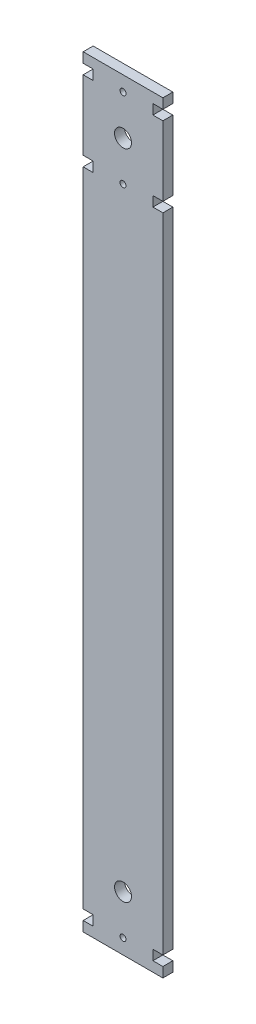
ISO-10303-21;
HEADER;
FILE_DESCRIPTION(('STEP AP214'),'2;1');
FILE_NAME('part.step','',(''),(''),'','','');
FILE_SCHEMA(('AUTOMOTIVE_DESIGN { 1 0 10303 214 1 1 1 1 }'));
ENDSEC;
DATA;
#1=APPLICATION_CONTEXT('core data for automotive mechanical design processes');
#2=APPLICATION_PROTOCOL_DEFINITION('international standard','automotive_design',2000,#1);
#3=PRODUCT_CONTEXT('',#1,'mechanical');
#4=PRODUCT('Part','Part','',(#3));
#5=PRODUCT_RELATED_PRODUCT_CATEGORY('part','',(#4));
#6=PRODUCT_DEFINITION_FORMATION('','',#4);
#7=PRODUCT_DEFINITION_CONTEXT('part definition',#1,'design');
#8=PRODUCT_DEFINITION('design','',#6,#7);
#9=PRODUCT_DEFINITION_SHAPE('','',#8);
#10=(LENGTH_UNIT() NAMED_UNIT(*) SI_UNIT(.MILLI.,.METRE.));
#11=(NAMED_UNIT(*) PLANE_ANGLE_UNIT() SI_UNIT($,.RADIAN.));
#12=(NAMED_UNIT(*) SI_UNIT($,.STERADIAN.) SOLID_ANGLE_UNIT());
#13=UNCERTAINTY_MEASURE_WITH_UNIT(LENGTH_MEASURE(1.E-05),#10,'distance_accuracy_value','');
#14=(GEOMETRIC_REPRESENTATION_CONTEXT(3) GLOBAL_UNCERTAINTY_ASSIGNED_CONTEXT((#13)) GLOBAL_UNIT_ASSIGNED_CONTEXT((#10,
#11,#12)) REPRESENTATION_CONTEXT('',''));
#15=CARTESIAN_POINT('',(0.,0.,0.));
#16=DIRECTION('',(0.,0.,1.));
#17=DIRECTION('',(1.,0.,0.));
#18=AXIS2_PLACEMENT_3D('',#15,#16,#17);
#19=CARTESIAN_POINT('',(-46.5428244656313,-25.2154467168999,5.00000000000018));
#20=DIRECTION('',(0.,0.,1.));
#21=DIRECTION('',(1.,0.,0.));
#22=AXIS2_PLACEMENT_3D('',#19,#20,#21);
#23=PLANE('',#22);
#24=CARTESIAN_POINT('',(-46.5428244656313,-17.7154467168999,5.00000000000018));
#25=DIRECTION('',(0.,0.,1.));
#26=DIRECTION('',(1.,0.,0.));
#27=AXIS2_PLACEMENT_3D('',#24,#25,#26);
#28=CIRCLE('',#27,1.5);
#29=CARTESIAN_POINT('',(-45.0428244656313,-17.7154467168999,5.00000000000018));
#30=VERTEX_POINT('',#29);
#31=EDGE_CURVE('E369',#30,#30,#28,.T.);
#32=ORIENTED_EDGE('',*,*,#31,.F.);
#33=EDGE_LOOP('',(#32));
#34=FACE_BOUND('',#33,.T.);
#35=DIRECTION('',(0.,-1.,0.));
#36=VECTOR('',#35,1.);
#37=CARTESIAN_POINT('',(-66.5428244656313,-20.2154467168998,5.00000000000018));
#38=LINE('',#37,#36);
#39=CARTESIAN_POINT('',(-66.5428244656313,-20.2154467168998,5.00000000000018));
#40=VERTEX_POINT('',#39);
#41=CARTESIAN_POINT('',(-66.5428244656313,-342.7154467169,5.00000000000018));
#42=VERTEX_POINT('',#41);
#43=EDGE_CURVE('E232',#40,#42,#38,.T.);
#44=ORIENTED_EDGE('',*,*,#43,.T.);
#45=DIRECTION('',(1.,0.,0.));
#46=VECTOR('',#45,1.);
#47=CARTESIAN_POINT('',(-66.5428244656313,-342.7154467169,5.00000000000018));
#48=LINE('',#47,#46);
#49=CARTESIAN_POINT('',(-61.5428244656313,-342.7154467169,5.00000000000018));
#50=VERTEX_POINT('',#49);
#51=EDGE_CURVE('E350',#42,#50,#48,.T.);
#52=ORIENTED_EDGE('',*,*,#51,.T.);
#53=DIRECTION('',(0.,-1.,0.));
#54=VECTOR('',#53,1.);
#55=CARTESIAN_POINT('',(-61.5428244656313,-342.7154467169,5.00000000000018));
#56=LINE('',#55,#54);
#57=CARTESIAN_POINT('',(-61.5428244656313,-347.7154467169,5.00000000000018));
#58=VERTEX_POINT('',#57);
#59=EDGE_CURVE('E459',#50,#58,#56,.T.);
#60=ORIENTED_EDGE('',*,*,#59,.T.);
#61=DIRECTION('',(-1.,0.,0.));
#62=VECTOR('',#61,1.);
#63=CARTESIAN_POINT('',(-61.5428244656313,-347.7154467169,5.00000000000018));
#64=LINE('',#63,#62);
#65=CARTESIAN_POINT('',(-66.5428244656313,-347.7154467169,5.00000000000018));
#66=VERTEX_POINT('',#65);
#67=EDGE_CURVE('E466',#58,#66,#64,.T.);
#68=ORIENTED_EDGE('',*,*,#67,.T.);
#69=DIRECTION('',(0.,-1.,0.));
#70=VECTOR('',#69,1.);
#71=CARTESIAN_POINT('',(-66.5428244656313,-347.7154467169,5.00000000000018));
#72=LINE('',#71,#70);
#73=CARTESIAN_POINT('',(-66.5428244656313,-352.7154467169,5.00000000000018));
#74=VERTEX_POINT('',#73);
#75=EDGE_CURVE('E471',#66,#74,#72,.T.);
#76=ORIENTED_EDGE('',*,*,#75,.T.);
#77=DIRECTION('',(1.,0.,0.));
#78=VECTOR('',#77,1.);
#79=CARTESIAN_POINT('',(-66.5428244656313,-352.7154467169,5.00000000000018));
#80=LINE('',#79,#78);
#81=CARTESIAN_POINT('',(-26.5428244656313,-352.7154467169,5.00000000000018));
#82=VERTEX_POINT('',#81);
#83=EDGE_CURVE('E478',#74,#82,#80,.T.);
#84=ORIENTED_EDGE('',*,*,#83,.T.);
#85=DIRECTION('',(0.,1.,0.));
#86=VECTOR('',#85,1.);
#87=CARTESIAN_POINT('',(-26.5428244656313,-352.7154467169,5.00000000000018));
#88=LINE('',#87,#86);
#89=CARTESIAN_POINT('',(-26.5428244656313,-347.7154467169,5.00000000000018));
#90=VERTEX_POINT('',#89);
#91=EDGE_CURVE('E438',#82,#90,#88,.T.);
#92=ORIENTED_EDGE('',*,*,#91,.T.);
#93=DIRECTION('',(-1.,0.,0.));
#94=VECTOR('',#93,1.);
#95=CARTESIAN_POINT('',(-26.5428244656313,-347.7154467169,5.00000000000018));
#96=LINE('',#95,#94);
#97=CARTESIAN_POINT('',(-31.5428244656313,-347.7154467169,5.00000000000018));
#98=VERTEX_POINT('',#97);
#99=EDGE_CURVE('E436',#90,#98,#96,.T.);
#100=ORIENTED_EDGE('',*,*,#99,.T.);
#101=DIRECTION('',(0.,1.,0.));
#102=VECTOR('',#101,1.);
#103=CARTESIAN_POINT('',(-31.5428244656313,-347.7154467169,5.00000000000018));
#104=LINE('',#103,#102);
#105=CARTESIAN_POINT('',(-31.5428244656313,-342.7154467169,5.00000000000018));
#106=VERTEX_POINT('',#105);
#107=EDGE_CURVE('E426',#98,#106,#104,.T.);
#108=ORIENTED_EDGE('',*,*,#107,.T.);
#109=DIRECTION('',(1.,0.,0.));
#110=VECTOR('',#109,1.);
#111=CARTESIAN_POINT('',(-31.5428244656313,-342.7154467169,5.00000000000018));
#112=LINE('',#111,#110);
#113=CARTESIAN_POINT('',(-26.5428244656313,-342.7154467169,5.00000000000018));
#114=VERTEX_POINT('',#113);
#115=EDGE_CURVE('E431',#106,#114,#112,.T.);
#116=ORIENTED_EDGE('',*,*,#115,.T.);
#117=DIRECTION('',(0.,1.,0.));
#118=VECTOR('',#117,1.);
#119=CARTESIAN_POINT('',(-26.5428244656313,-25.2154467168999,5.00000000000018));
#120=LINE('',#119,#118);
#121=CARTESIAN_POINT('',(-26.5428244656313,-20.2154467168998,5.00000000000018));
#122=VERTEX_POINT('',#121);
#123=EDGE_CURVE('E124',#114,#122,#120,.T.);
#124=ORIENTED_EDGE('',*,*,#123,.T.);
#125=DIRECTION('',(-1.,0.,0.));
#126=VECTOR('',#125,1.);
#127=CARTESIAN_POINT('',(-26.5428244656313,-20.2154467168998,5.00000000000018));
#128=LINE('',#127,#126);
#129=CARTESIAN_POINT('',(-31.5428244656313,-20.2154467168999,5.00000000000018));
#130=VERTEX_POINT('',#129);
#131=EDGE_CURVE('E381',#122,#130,#128,.T.);
#132=ORIENTED_EDGE('',*,*,#131,.T.);
#133=DIRECTION('',(0.,1.,0.));
#134=VECTOR('',#133,1.);
#135=CARTESIAN_POINT('',(-31.5428244656313,-20.2154467168999,5.00000000000018));
#136=LINE('',#135,#134);
#137=CARTESIAN_POINT('',(-31.5428244656313,-15.2154467168999,5.00000000000018));
#138=VERTEX_POINT('',#137);
#139=EDGE_CURVE('E278',#130,#138,#136,.T.);
#140=ORIENTED_EDGE('',*,*,#139,.T.);
#141=DIRECTION('',(1.,0.,0.));
#142=VECTOR('',#141,1.);
#143=CARTESIAN_POINT('',(-31.5428244656313,-15.2154467168999,5.00000000000018));
#144=LINE('',#143,#142);
#145=CARTESIAN_POINT('',(-26.5428244656313,-15.2154467168998,5.00000000000018));
#146=VERTEX_POINT('',#145);
#147=EDGE_CURVE('E301',#138,#146,#144,.T.);
#148=ORIENTED_EDGE('',*,*,#147,.T.);
#149=DIRECTION('',(0.,1.,0.));
#150=VECTOR('',#149,1.);
#151=CARTESIAN_POINT('',(-26.5428244656313,-15.2154467168998,5.00000000000018));
#152=LINE('',#151,#150);
#153=CARTESIAN_POINT('',(-26.5428244656313,19.7845532831001,5.00000000000018));
#154=VERTEX_POINT('',#153);
#155=EDGE_CURVE('E298',#146,#154,#152,.T.);
#156=ORIENTED_EDGE('',*,*,#155,.T.);
#157=DIRECTION('',(-1.,0.,0.));
#158=VECTOR('',#157,1.);
#159=CARTESIAN_POINT('',(-26.5428244656313,19.7845532831001,5.00000000000018));
#160=LINE('',#159,#158);
#161=CARTESIAN_POINT('',(-31.5428244656313,19.7845532831001,5.00000000000018));
#162=VERTEX_POINT('',#161);
#163=EDGE_CURVE('E300',#154,#162,#160,.T.);
#164=ORIENTED_EDGE('',*,*,#163,.T.);
#165=DIRECTION('',(0.,1.,0.));
#166=VECTOR('',#165,1.);
#167=CARTESIAN_POINT('',(-31.5428244656313,19.7845532831001,5.00000000000018));
#168=LINE('',#167,#166);
#169=CARTESIAN_POINT('',(-31.5428244656313,24.7845532831001,5.00000000000018));
#170=VERTEX_POINT('',#169);
#171=EDGE_CURVE('E303',#162,#170,#168,.T.);
#172=ORIENTED_EDGE('',*,*,#171,.T.);
#173=DIRECTION('',(1.,0.,0.));
#174=VECTOR('',#173,1.);
#175=CARTESIAN_POINT('',(-31.5428244656313,24.7845532831001,5.00000000000018));
#176=LINE('',#175,#174);
#177=CARTESIAN_POINT('',(-26.5428244656313,24.7845532831001,5.00000000000018));
#178=VERTEX_POINT('',#177);
#179=EDGE_CURVE('E309',#170,#178,#176,.T.);
#180=ORIENTED_EDGE('',*,*,#179,.T.);
#181=DIRECTION('',(0.,1.,0.));
#182=VECTOR('',#181,1.);
#183=CARTESIAN_POINT('',(-26.5428244656313,24.7845532831001,5.00000000000018));
#184=LINE('',#183,#182);
#185=CARTESIAN_POINT('',(-26.5428244656313,29.7845532831002,5.00000000000018));
#186=VERTEX_POINT('',#185);
#187=EDGE_CURVE('E311',#178,#186,#184,.T.);
#188=ORIENTED_EDGE('',*,*,#187,.T.);
#189=DIRECTION('',(-1.,0.,0.));
#190=VECTOR('',#189,1.);
#191=CARTESIAN_POINT('',(-26.5428244656313,29.7845532831002,5.00000000000018));
#192=LINE('',#191,#190);
#193=CARTESIAN_POINT('',(-66.5428244656313,29.7845532831002,5.00000000000018));
#194=VERTEX_POINT('',#193);
#195=EDGE_CURVE('E313',#186,#194,#192,.T.);
#196=ORIENTED_EDGE('',*,*,#195,.T.);
#197=DIRECTION('',(0.,-1.,0.));
#198=VECTOR('',#197,1.);
#199=CARTESIAN_POINT('',(-66.5428244656313,29.7845532831002,5.00000000000018));
#200=LINE('',#199,#198);
#201=CARTESIAN_POINT('',(-66.5428244656313,24.7845532831001,5.00000000000018));
#202=VERTEX_POINT('',#201);
#203=EDGE_CURVE('E315',#194,#202,#200,.T.);
#204=ORIENTED_EDGE('',*,*,#203,.T.);
#205=DIRECTION('',(1.,0.,0.));
#206=VECTOR('',#205,1.);
#207=CARTESIAN_POINT('',(-66.5428244656313,24.7845532831001,5.00000000000018));
#208=LINE('',#207,#206);
#209=CARTESIAN_POINT('',(-61.5428244656313,24.7845532831001,5.00000000000018));
#210=VERTEX_POINT('',#209);
#211=EDGE_CURVE('E317',#202,#210,#208,.T.);
#212=ORIENTED_EDGE('',*,*,#211,.T.);
#213=DIRECTION('',(0.,-1.,0.));
#214=VECTOR('',#213,1.);
#215=CARTESIAN_POINT('',(-61.5428244656313,24.7845532831001,5.00000000000018));
#216=LINE('',#215,#214);
#217=CARTESIAN_POINT('',(-61.5428244656313,19.7845532831001,5.00000000000018));
#218=VERTEX_POINT('',#217);
#219=EDGE_CURVE('E319',#210,#218,#216,.T.);
#220=ORIENTED_EDGE('',*,*,#219,.T.);
#221=DIRECTION('',(-1.,0.,0.));
#222=VECTOR('',#221,1.);
#223=CARTESIAN_POINT('',(-61.5428244656313,19.7845532831001,5.00000000000018));
#224=LINE('',#223,#222);
#225=CARTESIAN_POINT('',(-66.5428244656313,19.7845532831001,5.00000000000018));
#226=VERTEX_POINT('',#225);
#227=EDGE_CURVE('E321',#218,#226,#224,.T.);
#228=ORIENTED_EDGE('',*,*,#227,.T.);
#229=DIRECTION('',(0.,-1.,0.));
#230=VECTOR('',#229,1.);
#231=CARTESIAN_POINT('',(-66.5428244656313,19.7845532831001,5.00000000000018));
#232=LINE('',#231,#230);
#233=CARTESIAN_POINT('',(-66.5428244656313,-15.2154467168998,5.00000000000018));
#234=VERTEX_POINT('',#233);
#235=EDGE_CURVE('E177',#226,#234,#232,.T.);
#236=ORIENTED_EDGE('',*,*,#235,.T.);
#237=DIRECTION('',(1.,0.,0.));
#238=VECTOR('',#237,1.);
#239=CARTESIAN_POINT('',(-66.5428244656313,-15.2154467168998,5.00000000000018));
#240=LINE('',#239,#238);
#241=CARTESIAN_POINT('',(-61.5428244656313,-15.2154467168999,5.00000000000018));
#242=VERTEX_POINT('',#241);
#243=EDGE_CURVE('E171',#234,#242,#240,.T.);
#244=ORIENTED_EDGE('',*,*,#243,.T.);
#245=DIRECTION('',(0.,-1.,0.));
#246=VECTOR('',#245,1.);
#247=CARTESIAN_POINT('',(-61.5428244656313,-15.2154467168999,5.00000000000018));
#248=LINE('',#247,#246);
#249=CARTESIAN_POINT('',(-61.5428244656313,-20.2154467168999,5.00000000000018));
#250=VERTEX_POINT('',#249);
#251=EDGE_CURVE('E175',#242,#250,#248,.T.);
#252=ORIENTED_EDGE('',*,*,#251,.T.);
#253=DIRECTION('',(-1.,0.,0.));
#254=VECTOR('',#253,1.);
#255=CARTESIAN_POINT('',(-61.5428244656313,-20.2154467168999,5.00000000000018));
#256=LINE('',#255,#254);
#257=EDGE_CURVE('E50',#250,#40,#256,.T.);
#258=ORIENTED_EDGE('',*,*,#257,.T.);
#259=EDGE_LOOP('',(#44,#52,#60,#68,#76,#84,#92,#100,#108,#116,#124,#132,#140,#148,#156,#164,
#172,#180,#188,#196,#204,#212,#220,#228,#236,#244,#252,#258));
#260=FACE_BOUND('',#259,.T.);
#261=CARTESIAN_POINT('',(-46.5428244656313,22.2845532831002,5.00000000000018));
#262=DIRECTION('',(0.,0.,1.));
#263=DIRECTION('',(1.,0.,0.));
#264=AXIS2_PLACEMENT_3D('',#261,#262,#263);
#265=CIRCLE('',#264,1.5);
#266=CARTESIAN_POINT('',(-45.0428244656313,22.2845532831002,5.00000000000018));
#267=VERTEX_POINT('',#266);
#268=EDGE_CURVE('E199',#267,#267,#265,.T.);
#269=ORIENTED_EDGE('',*,*,#268,.F.);
#270=EDGE_LOOP('',(#269));
#271=FACE_BOUND('',#270,.T.);
#272=CARTESIAN_POINT('',(-46.5428244656313,2.28455328310016,5.00000000000018));
#273=DIRECTION('',(0.,0.,1.));
#274=DIRECTION('',(1.,0.,0.));
#275=AXIS2_PLACEMENT_3D('',#272,#273,#274);
#276=CIRCLE('',#275,4.25);
#277=CARTESIAN_POINT('',(-42.2928244656313,2.28455328310016,5.00000000000018));
#278=VERTEX_POINT('',#277);
#279=EDGE_CURVE('E361',#278,#278,#276,.T.);
#280=ORIENTED_EDGE('',*,*,#279,.F.);
#281=EDGE_LOOP('',(#280));
#282=FACE_BOUND('',#281,.T.);
#283=CARTESIAN_POINT('',(-46.5428244656313,-325.2154467169,5.00000000000018));
#284=DIRECTION('',(0.,0.,1.));
#285=DIRECTION('',(-1.,0.,0.));
#286=AXIS2_PLACEMENT_3D('',#283,#284,#285);
#287=CIRCLE('',#286,4.24999999999999);
#288=CARTESIAN_POINT('',(-50.7928244656313,-325.2154467169,5.00000000000018));
#289=VERTEX_POINT('',#288);
#290=EDGE_CURVE('E516',#289,#289,#287,.T.);
#291=ORIENTED_EDGE('',*,*,#290,.F.);
#292=EDGE_LOOP('',(#291));
#293=FACE_BOUND('',#292,.T.);
#294=CARTESIAN_POINT('',(-46.5428244656313,-345.2154467169,5.00000000000018));
#295=DIRECTION('',(0.,0.,1.));
#296=DIRECTION('',(1.,0.,0.));
#297=AXIS2_PLACEMENT_3D('',#294,#295,#296);
#298=CIRCLE('',#297,1.5);
#299=CARTESIAN_POINT('',(-45.0428244656313,-345.2154467169,5.00000000000018));
#300=VERTEX_POINT('',#299);
#301=EDGE_CURVE('E510',#300,#300,#298,.T.);
#302=ORIENTED_EDGE('',*,*,#301,.F.);
#303=EDGE_LOOP('',(#302));
#304=FACE_BOUND('',#303,.T.);
#305=ADVANCED_FACE('F33',(#34,#260,#271,#282,#293,#304),#23,.T.);
#306=CARTESIAN_POINT('',(-46.5428244656313,-25.2154467168999,1.76078523325299E-13));
#307=DIRECTION('',(0.,0.,1.));
#308=DIRECTION('',(1.,0.,0.));
#309=AXIS2_PLACEMENT_3D('',#306,#307,#308);
#310=PLANE('',#309);
#311=DIRECTION('',(0.,-1.,0.));
#312=VECTOR('',#311,1.);
#313=CARTESIAN_POINT('',(-66.5428244656313,-20.2154467168998,1.76078523325299E-13));
#314=LINE('',#313,#312);
#315=CARTESIAN_POINT('',(-66.5428244656313,-20.2154467168998,1.76078523325299E-13));
#316=VERTEX_POINT('',#315);
#317=CARTESIAN_POINT('',(-66.5428244656313,-342.7154467169,1.76074432811646E-13));
#318=VERTEX_POINT('',#317);
#319=EDGE_CURVE('E195',#316,#318,#314,.T.);
#320=ORIENTED_EDGE('',*,*,#319,.F.);
#321=DIRECTION('',(-1.,0.,0.));
#322=VECTOR('',#321,1.);
#323=CARTESIAN_POINT('',(-61.5428244656313,-20.2154467168999,1.76078523325299E-13));
#324=LINE('',#323,#322);
#325=CARTESIAN_POINT('',(-61.5428244656313,-20.2154467168999,1.76078523325299E-13));
#326=VERTEX_POINT('',#325);
#327=EDGE_CURVE('E116',#326,#316,#324,.T.);
#328=ORIENTED_EDGE('',*,*,#327,.F.);
#329=DIRECTION('',(0.,-1.,0.));
#330=VECTOR('',#329,1.);
#331=CARTESIAN_POINT('',(-61.5428244656313,-15.2154467168999,1.76078523325299E-13));
#332=LINE('',#331,#330);
#333=CARTESIAN_POINT('',(-61.5428244656313,-15.2154467168999,1.76078523325299E-13));
#334=VERTEX_POINT('',#333);
#335=EDGE_CURVE('E110',#334,#326,#332,.T.);
#336=ORIENTED_EDGE('',*,*,#335,.F.);
#337=DIRECTION('',(1.,0.,0.));
#338=VECTOR('',#337,1.);
#339=CARTESIAN_POINT('',(-66.5428244656313,-15.2154467168998,1.76078523325299E-13));
#340=LINE('',#339,#338);
#341=CARTESIAN_POINT('',(-66.5428244656313,-15.2154467168998,1.76078523325299E-13));
#342=VERTEX_POINT('',#341);
#343=EDGE_CURVE('E185',#342,#334,#340,.T.);
#344=ORIENTED_EDGE('',*,*,#343,.F.);
#345=DIRECTION('',(0.,-1.,0.));
#346=VECTOR('',#345,1.);
#347=CARTESIAN_POINT('',(-66.5428244656313,19.7845532831001,1.76078523325299E-13));
#348=LINE('',#347,#346);
#349=CARTESIAN_POINT('',(-66.5428244656313,19.7845532831001,1.76078523325299E-13));
#350=VERTEX_POINT('',#349);
#351=EDGE_CURVE('E227',#350,#342,#348,.T.);
#352=ORIENTED_EDGE('',*,*,#351,.F.);
#353=DIRECTION('',(-1.,0.,0.));
#354=VECTOR('',#353,1.);
#355=CARTESIAN_POINT('',(-61.5428244656313,19.7845532831001,1.76078523325299E-13));
#356=LINE('',#355,#354);
#357=CARTESIAN_POINT('',(-61.5428244656313,19.7845532831001,1.76078523325299E-13));
#358=VERTEX_POINT('',#357);
#359=EDGE_CURVE('E225',#358,#350,#356,.T.);
#360=ORIENTED_EDGE('',*,*,#359,.F.);
#361=DIRECTION('',(0.,-1.,0.));
#362=VECTOR('',#361,1.);
#363=CARTESIAN_POINT('',(-61.5428244656313,24.7845532831001,1.76078523325299E-13));
#364=LINE('',#363,#362);
#365=CARTESIAN_POINT('',(-61.5428244656313,24.7845532831001,1.76078523325299E-13));
#366=VERTEX_POINT('',#365);
#367=EDGE_CURVE('E223',#366,#358,#364,.T.);
#368=ORIENTED_EDGE('',*,*,#367,.F.);
#369=DIRECTION('',(1.,0.,0.));
#370=VECTOR('',#369,1.);
#371=CARTESIAN_POINT('',(-66.5428244656313,24.7845532831001,1.76078523325299E-13));
#372=LINE('',#371,#370);
#373=CARTESIAN_POINT('',(-66.5428244656313,24.7845532831001,1.76078523325299E-13));
#374=VERTEX_POINT('',#373);
#375=EDGE_CURVE('E221',#374,#366,#372,.T.);
#376=ORIENTED_EDGE('',*,*,#375,.F.);
#377=DIRECTION('',(0.,-1.,0.));
#378=VECTOR('',#377,1.);
#379=CARTESIAN_POINT('',(-66.5428244656313,29.7845532831002,1.76078523325299E-13));
#380=LINE('',#379,#378);
#381=CARTESIAN_POINT('',(-66.5428244656313,29.7845532831002,1.76078523325299E-13));
#382=VERTEX_POINT('',#381);
#383=EDGE_CURVE('E219',#382,#374,#380,.T.);
#384=ORIENTED_EDGE('',*,*,#383,.F.);
#385=DIRECTION('',(-1.,0.,0.));
#386=VECTOR('',#385,1.);
#387=CARTESIAN_POINT('',(-26.5428244656313,29.7845532831002,1.76078523325299E-13));
#388=LINE('',#387,#386);
#389=CARTESIAN_POINT('',(-26.5428244656313,29.7845532831002,1.76078523325299E-13));
#390=VERTEX_POINT('',#389);
#391=EDGE_CURVE('E217',#390,#382,#388,.T.);
#392=ORIENTED_EDGE('',*,*,#391,.F.);
#393=DIRECTION('',(0.,1.,0.));
#394=VECTOR('',#393,1.);
#395=CARTESIAN_POINT('',(-26.5428244656313,24.7845532831001,1.76078523325299E-13));
#396=LINE('',#395,#394);
#397=CARTESIAN_POINT('',(-26.5428244656313,24.7845532831001,1.76078523325299E-13));
#398=VERTEX_POINT('',#397);
#399=EDGE_CURVE('E215',#398,#390,#396,.T.);
#400=ORIENTED_EDGE('',*,*,#399,.F.);
#401=DIRECTION('',(1.,0.,0.));
#402=VECTOR('',#401,1.);
#403=CARTESIAN_POINT('',(-31.5428244656313,24.7845532831001,1.76078523325299E-13));
#404=LINE('',#403,#402);
#405=CARTESIAN_POINT('',(-31.5428244656313,24.7845532831001,1.76078523325299E-13));
#406=VERTEX_POINT('',#405);
#407=EDGE_CURVE('E213',#406,#398,#404,.T.);
#408=ORIENTED_EDGE('',*,*,#407,.F.);
#409=DIRECTION('',(0.,1.,0.));
#410=VECTOR('',#409,1.);
#411=CARTESIAN_POINT('',(-31.5428244656313,19.7845532831001,1.76078523325299E-13));
#412=LINE('',#411,#410);
#413=CARTESIAN_POINT('',(-31.5428244656313,19.7845532831001,1.76078523325299E-13));
#414=VERTEX_POINT('',#413);
#415=EDGE_CURVE('E211',#414,#406,#412,.T.);
#416=ORIENTED_EDGE('',*,*,#415,.F.);
#417=DIRECTION('',(-1.,0.,0.));
#418=VECTOR('',#417,1.);
#419=CARTESIAN_POINT('',(-26.5428244656313,19.7845532831001,1.76078523325299E-13));
#420=LINE('',#419,#418);
#421=CARTESIAN_POINT('',(-26.5428244656313,19.7845532831001,1.76078523325299E-13));
#422=VERTEX_POINT('',#421);
#423=EDGE_CURVE('E209',#422,#414,#420,.T.);
#424=ORIENTED_EDGE('',*,*,#423,.F.);
#425=DIRECTION('',(0.,1.,0.));
#426=VECTOR('',#425,1.);
#427=CARTESIAN_POINT('',(-26.5428244656313,-15.2154467168998,1.76078523325299E-13));
#428=LINE('',#427,#426);
#429=CARTESIAN_POINT('',(-26.5428244656313,-15.2154467168998,1.76078523325299E-13));
#430=VERTEX_POINT('',#429);
#431=EDGE_CURVE('E207',#430,#422,#428,.T.);
#432=ORIENTED_EDGE('',*,*,#431,.F.);
#433=DIRECTION('',(1.,0.,0.));
#434=VECTOR('',#433,1.);
#435=CARTESIAN_POINT('',(-31.5428244656313,-15.2154467168999,1.76078523325299E-13));
#436=LINE('',#435,#434);
#437=CARTESIAN_POINT('',(-31.5428244656313,-15.2154467168999,1.76078523325299E-13));
#438=VERTEX_POINT('',#437);
#439=EDGE_CURVE('E205',#438,#430,#436,.T.);
#440=ORIENTED_EDGE('',*,*,#439,.F.);
#441=DIRECTION('',(0.,1.,0.));
#442=VECTOR('',#441,1.);
#443=CARTESIAN_POINT('',(-31.5428244656313,-20.2154467168999,1.76078523325299E-13));
#444=LINE('',#443,#442);
#445=CARTESIAN_POINT('',(-31.5428244656313,-20.2154467168999,1.76078523325299E-13));
#446=VERTEX_POINT('',#445);
#447=EDGE_CURVE('E203',#446,#438,#444,.T.);
#448=ORIENTED_EDGE('',*,*,#447,.F.);
#449=DIRECTION('',(-1.,0.,0.));
#450=VECTOR('',#449,1.);
#451=CARTESIAN_POINT('',(-26.5428244656313,-20.2154467168998,1.76078523325299E-13));
#452=LINE('',#451,#450);
#453=CARTESIAN_POINT('',(-26.5428244656313,-20.2154467168998,1.76078523325299E-13));
#454=VERTEX_POINT('',#453);
#455=EDGE_CURVE('E201',#454,#446,#452,.T.);
#456=ORIENTED_EDGE('',*,*,#455,.F.);
#457=DIRECTION('',(0.,1.,0.));
#458=VECTOR('',#457,1.);
#459=CARTESIAN_POINT('',(-26.5428244656313,-25.2154467168999,1.76078523325299E-13));
#460=LINE('',#459,#458);
#461=CARTESIAN_POINT('',(-26.5428244656313,-342.7154467169,1.76074432811646E-13));
#462=VERTEX_POINT('',#461);
#463=EDGE_CURVE('E198',#462,#454,#460,.T.);
#464=ORIENTED_EDGE('',*,*,#463,.F.);
#465=DIRECTION('',(1.,0.,0.));
#466=VECTOR('',#465,1.);
#467=CARTESIAN_POINT('',(-31.5428244656313,-342.7154467169,1.76074432811646E-13));
#468=LINE('',#467,#466);
#469=CARTESIAN_POINT('',(-31.5428244656313,-342.7154467169,1.76074432811646E-13));
#470=VERTEX_POINT('',#469);
#471=EDGE_CURVE('E352',#470,#462,#468,.T.);
#472=ORIENTED_EDGE('',*,*,#471,.F.);
#473=DIRECTION('',(0.,1.,0.));
#474=VECTOR('',#473,1.);
#475=CARTESIAN_POINT('',(-31.5428244656313,-347.7154467169,1.76074432811646E-13));
#476=LINE('',#475,#474);
#477=CARTESIAN_POINT('',(-31.5428244656313,-347.7154467169,1.76074432811646E-13));
#478=VERTEX_POINT('',#477);
#479=EDGE_CURVE('E357',#478,#470,#476,.T.);
#480=ORIENTED_EDGE('',*,*,#479,.F.);
#481=DIRECTION('',(-1.,0.,0.));
#482=VECTOR('',#481,1.);
#483=CARTESIAN_POINT('',(-26.5428244656313,-347.7154467169,1.76074432811646E-13));
#484=LINE('',#483,#482);
#485=CARTESIAN_POINT('',(-26.5428244656313,-347.7154467169,1.76074432811646E-13));
#486=VERTEX_POINT('',#485);
#487=EDGE_CURVE('E495',#486,#478,#484,.T.);
#488=ORIENTED_EDGE('',*,*,#487,.F.);
#489=DIRECTION('',(0.,1.,0.));
#490=VECTOR('',#489,1.);
#491=CARTESIAN_POINT('',(-26.5428244656313,-352.7154467169,1.76074432811646E-13));
#492=LINE('',#491,#490);
#493=CARTESIAN_POINT('',(-26.5428244656313,-352.7154467169,1.76074432811646E-13));
#494=VERTEX_POINT('',#493);
#495=EDGE_CURVE('E490',#494,#486,#492,.T.);
#496=ORIENTED_EDGE('',*,*,#495,.F.);
#497=DIRECTION('',(1.,0.,0.));
#498=VECTOR('',#497,1.);
#499=CARTESIAN_POINT('',(-66.5428244656313,-352.7154467169,1.76074432811646E-13));
#500=LINE('',#499,#498);
#501=CARTESIAN_POINT('',(-66.5428244656313,-352.7154467169,1.76074432811646E-13));
#502=VERTEX_POINT('',#501);
#503=EDGE_CURVE('E500',#502,#494,#500,.T.);
#504=ORIENTED_EDGE('',*,*,#503,.F.);
#505=DIRECTION('',(0.,-1.,0.));
#506=VECTOR('',#505,1.);
#507=CARTESIAN_POINT('',(-66.5428244656313,-347.7154467169,1.76074432811646E-13));
#508=LINE('',#507,#506);
#509=CARTESIAN_POINT('',(-66.5428244656313,-347.7154467169,1.76074432811646E-13));
#510=VERTEX_POINT('',#509);
#511=EDGE_CURVE('E503',#510,#502,#508,.T.);
#512=ORIENTED_EDGE('',*,*,#511,.F.);
#513=DIRECTION('',(-1.,0.,0.));
#514=VECTOR('',#513,1.);
#515=CARTESIAN_POINT('',(-61.5428244656313,-347.7154467169,1.76074432811646E-13));
#516=LINE('',#515,#514);
#517=CARTESIAN_POINT('',(-61.5428244656313,-347.7154467169,1.76074432811646E-13));
#518=VERTEX_POINT('',#517);
#519=EDGE_CURVE('E506',#518,#510,#516,.T.);
#520=ORIENTED_EDGE('',*,*,#519,.F.);
#521=DIRECTION('',(0.,-1.,0.));
#522=VECTOR('',#521,1.);
#523=CARTESIAN_POINT('',(-61.5428244656313,-342.7154467169,1.76074432811646E-13));
#524=LINE('',#523,#522);
#525=CARTESIAN_POINT('',(-61.5428244656313,-342.7154467169,1.76074432811646E-13));
#526=VERTEX_POINT('',#525);
#527=EDGE_CURVE('E461',#526,#518,#524,.T.);
#528=ORIENTED_EDGE('',*,*,#527,.F.);
#529=DIRECTION('',(1.,0.,0.));
#530=VECTOR('',#529,1.);
#531=CARTESIAN_POINT('',(-66.5428244656313,-342.7154467169,1.76074432811646E-13));
#532=LINE('',#531,#530);
#533=EDGE_CURVE('E336',#318,#526,#532,.T.);
#534=ORIENTED_EDGE('',*,*,#533,.F.);
#535=EDGE_LOOP('',(#320,#328,#336,#344,#352,#360,#368,#376,#384,#392,#400,#408,#416,#424,#432,
#440,#448,#456,#464,#472,#480,#488,#496,#504,#512,#520,#528,#534));
#536=FACE_BOUND('',#535,.T.);
#537=CARTESIAN_POINT('',(-46.5428244656313,22.2845532831002,1.76078523325299E-13));
#538=DIRECTION('',(0.,0.,1.));
#539=DIRECTION('',(1.,0.,0.));
#540=AXIS2_PLACEMENT_3D('',#537,#538,#539);
#541=CIRCLE('',#540,1.5);
#542=CARTESIAN_POINT('',(-45.0428244656313,22.2845532831002,1.76078523325299E-13));
#543=VERTEX_POINT('',#542);
#544=EDGE_CURVE('E372',#543,#543,#541,.T.);
#545=ORIENTED_EDGE('',*,*,#544,.T.);
#546=EDGE_LOOP('',(#545));
#547=FACE_BOUND('',#546,.T.);
#548=CARTESIAN_POINT('',(-46.5428244656313,-17.7154467168999,1.76078523325299E-13));
#549=DIRECTION('',(0.,0.,1.));
#550=DIRECTION('',(1.,0.,0.));
#551=AXIS2_PLACEMENT_3D('',#548,#549,#550);
#552=CIRCLE('',#551,1.5);
#553=CARTESIAN_POINT('',(-45.0428244656313,-17.7154467168999,1.76078523325299E-13));
#554=VERTEX_POINT('',#553);
#555=EDGE_CURVE('E364',#554,#554,#552,.T.);
#556=ORIENTED_EDGE('',*,*,#555,.T.);
#557=EDGE_LOOP('',(#556));
#558=FACE_BOUND('',#557,.T.);
#559=CARTESIAN_POINT('',(-46.5428244656313,2.28455328310016,1.76078523325299E-13));
#560=DIRECTION('',(0.,0.,1.));
#561=DIRECTION('',(1.,0.,0.));
#562=AXIS2_PLACEMENT_3D('',#559,#560,#561);
#563=CIRCLE('',#562,4.25);
#564=CARTESIAN_POINT('',(-42.2928244656313,2.28455328310016,1.76078523325299E-13));
#565=VERTEX_POINT('',#564);
#566=EDGE_CURVE('E365',#565,#565,#563,.T.);
#567=ORIENTED_EDGE('',*,*,#566,.T.);
#568=EDGE_LOOP('',(#567));
#569=FACE_BOUND('',#568,.T.);
#570=CARTESIAN_POINT('',(-46.5428244656313,-325.2154467169,1.76074432811646E-13));
#571=DIRECTION('',(0.,0.,1.));
#572=DIRECTION('',(-1.,0.,0.));
#573=AXIS2_PLACEMENT_3D('',#570,#571,#572);
#574=CIRCLE('',#573,4.24999999999999);
#575=CARTESIAN_POINT('',(-50.7928244656313,-325.2154467169,1.76074432811646E-13));
#576=VERTEX_POINT('',#575);
#577=EDGE_CURVE('E513',#576,#576,#574,.T.);
#578=ORIENTED_EDGE('',*,*,#577,.T.);
#579=EDGE_LOOP('',(#578));
#580=FACE_BOUND('',#579,.T.);
#581=CARTESIAN_POINT('',(-46.5428244656313,-345.2154467169,1.76074432811646E-13));
#582=DIRECTION('',(0.,0.,1.));
#583=DIRECTION('',(1.,0.,0.));
#584=AXIS2_PLACEMENT_3D('',#581,#582,#583);
#585=CIRCLE('',#584,1.5);
#586=CARTESIAN_POINT('',(-45.0428244656313,-345.2154467169,1.76074432811646E-13));
#587=VERTEX_POINT('',#586);
#588=EDGE_CURVE('E474',#587,#587,#585,.T.);
#589=ORIENTED_EDGE('',*,*,#588,.T.);
#590=EDGE_LOOP('',(#589));
#591=FACE_BOUND('',#590,.T.);
#592=ADVANCED_FACE('F285',(#536,#547,#558,#569,#580,#591),#310,.F.);
#593=CARTESIAN_POINT('',(-66.5428244656313,-20.2154467168998,5.00000000000018));
#594=DIRECTION('',(1.,0.,0.));
#595=DIRECTION('',(0.,0.,-1.));
#596=AXIS2_PLACEMENT_3D('',#593,#594,#595);
#597=PLANE('',#596);
#598=ORIENTED_EDGE('',*,*,#319,.T.);
#599=DIRECTION('',(0.,0.,1.));
#600=VECTOR('',#599,1.);
#601=CARTESIAN_POINT('',(-66.5428244656313,-342.7154467169,1.76074432811646E-13));
#602=LINE('',#601,#600);
#603=EDGE_CURVE('E342',#318,#42,#602,.T.);
#604=ORIENTED_EDGE('',*,*,#603,.T.);
#605=ORIENTED_EDGE('',*,*,#43,.F.);
#606=DIRECTION('',(0.,0.,-1.));
#607=VECTOR('',#606,1.);
#608=CARTESIAN_POINT('',(-66.5428244656313,-20.2154467168998,5.00000000000018));
#609=LINE('',#608,#607);
#610=EDGE_CURVE('E191',#40,#316,#609,.T.);
#611=ORIENTED_EDGE('',*,*,#610,.T.);
#612=EDGE_LOOP('',(#598,#604,#605,#611));
#613=FACE_BOUND('',#612,.T.);
#614=ADVANCED_FACE('F35',(#613),#597,.F.);
#615=CARTESIAN_POINT('',(-26.5428244656313,-25.2154467168999,5.00000000000018));
#616=DIRECTION('',(-1.,0.,0.));
#617=DIRECTION('',(0.,0.,1.));
#618=AXIS2_PLACEMENT_3D('',#615,#616,#617);
#619=PLANE('',#618);
#620=ORIENTED_EDGE('',*,*,#463,.T.);
#621=DIRECTION('',(0.,0.,-1.));
#622=VECTOR('',#621,1.);
#623=CARTESIAN_POINT('',(-26.5428244656313,-20.2154467168998,5.00000000000018));
#624=LINE('',#623,#622);
#625=EDGE_CURVE('E11',#122,#454,#624,.T.);
#626=ORIENTED_EDGE('',*,*,#625,.F.);
#627=ORIENTED_EDGE('',*,*,#123,.F.);
#628=DIRECTION('',(0.,0.,1.));
#629=VECTOR('',#628,1.);
#630=CARTESIAN_POINT('',(-26.5428244656313,-342.7154467169,1.76074432811646E-13));
#631=LINE('',#630,#629);
#632=EDGE_CURVE('E368',#462,#114,#631,.T.);
#633=ORIENTED_EDGE('',*,*,#632,.F.);
#634=EDGE_LOOP('',(#620,#626,#627,#633));
#635=FACE_BOUND('',#634,.T.);
#636=ADVANCED_FACE('F384',(#635),#619,.F.);
#637=CARTESIAN_POINT('',(-26.5428244656313,-20.2154467168998,5.00000000000018));
#638=DIRECTION('',(0.,-1.,0.));
#639=DIRECTION('',(1.,0.,0.));
#640=AXIS2_PLACEMENT_3D('',#637,#638,#639);
#641=PLANE('',#640);
#642=ORIENTED_EDGE('',*,*,#455,.T.);
#643=DIRECTION('',(0.,0.,-1.));
#644=VECTOR('',#643,1.);
#645=CARTESIAN_POINT('',(-31.5428244656313,-20.2154467168999,5.00000000000018));
#646=LINE('',#645,#644);
#647=EDGE_CURVE('E42',#130,#446,#646,.T.);
#648=ORIENTED_EDGE('',*,*,#647,.F.);
#649=ORIENTED_EDGE('',*,*,#131,.F.);
#650=ORIENTED_EDGE('',*,*,#625,.T.);
#651=EDGE_LOOP('',(#642,#648,#649,#650));
#652=FACE_BOUND('',#651,.T.);
#653=ADVANCED_FACE('F382',(#652),#641,.F.);
#654=CARTESIAN_POINT('',(-31.5428244656313,-20.2154467168999,5.00000000000018));
#655=DIRECTION('',(-1.,0.,0.));
#656=DIRECTION('',(0.,0.,1.));
#657=AXIS2_PLACEMENT_3D('',#654,#655,#656);
#658=PLANE('',#657);
#659=ORIENTED_EDGE('',*,*,#447,.T.);
#660=DIRECTION('',(0.,0.,-1.));
#661=VECTOR('',#660,1.);
#662=CARTESIAN_POINT('',(-31.5428244656313,-15.2154467168999,5.00000000000018));
#663=LINE('',#662,#661);
#664=EDGE_CURVE('E269',#138,#438,#663,.T.);
#665=ORIENTED_EDGE('',*,*,#664,.F.);
#666=ORIENTED_EDGE('',*,*,#139,.F.);
#667=ORIENTED_EDGE('',*,*,#647,.T.);
#668=EDGE_LOOP('',(#659,#665,#666,#667));
#669=FACE_BOUND('',#668,.T.);
#670=ADVANCED_FACE('F276',(#669),#658,.F.);
#671=CARTESIAN_POINT('',(-31.5428244656313,-15.2154467168999,5.00000000000018));
#672=DIRECTION('',(0.,1.,0.));
#673=DIRECTION('',(-1.,0.,0.));
#674=AXIS2_PLACEMENT_3D('',#671,#672,#673);
#675=PLANE('',#674);
#676=ORIENTED_EDGE('',*,*,#439,.T.);
#677=DIRECTION('',(0.,0.,-1.));
#678=VECTOR('',#677,1.);
#679=CARTESIAN_POINT('',(-26.5428244656313,-15.2154467168998,5.00000000000018));
#680=LINE('',#679,#678);
#681=EDGE_CURVE('E266',#146,#430,#680,.T.);
#682=ORIENTED_EDGE('',*,*,#681,.F.);
#683=ORIENTED_EDGE('',*,*,#147,.F.);
#684=ORIENTED_EDGE('',*,*,#664,.T.);
#685=EDGE_LOOP('',(#676,#682,#683,#684));
#686=FACE_BOUND('',#685,.T.);
#687=ADVANCED_FACE('F292',(#686),#675,.F.);
#688=CARTESIAN_POINT('',(-26.5428244656313,-15.2154467168998,5.00000000000018));
#689=DIRECTION('',(-1.,0.,0.));
#690=DIRECTION('',(0.,0.,1.));
#691=AXIS2_PLACEMENT_3D('',#688,#689,#690);
#692=PLANE('',#691);
#693=ORIENTED_EDGE('',*,*,#431,.T.);
#694=DIRECTION('',(0.,0.,-1.));
#695=VECTOR('',#694,1.);
#696=CARTESIAN_POINT('',(-26.5428244656313,19.7845532831001,5.00000000000018));
#697=LINE('',#696,#695);
#698=EDGE_CURVE('E263',#154,#422,#697,.T.);
#699=ORIENTED_EDGE('',*,*,#698,.F.);
#700=ORIENTED_EDGE('',*,*,#155,.F.);
#701=ORIENTED_EDGE('',*,*,#681,.T.);
#702=EDGE_LOOP('',(#693,#699,#700,#701));
#703=FACE_BOUND('',#702,.T.);
#704=ADVANCED_FACE('F296',(#703),#692,.F.);
#705=CARTESIAN_POINT('',(-26.5428244656313,19.7845532831001,5.00000000000018));
#706=DIRECTION('',(0.,-1.,0.));
#707=DIRECTION('',(0.,0.,-1.));
#708=AXIS2_PLACEMENT_3D('',#705,#706,#707);
#709=PLANE('',#708);
#710=ORIENTED_EDGE('',*,*,#423,.T.);
#711=DIRECTION('',(0.,0.,-1.));
#712=VECTOR('',#711,1.);
#713=CARTESIAN_POINT('',(-31.5428244656313,19.7845532831001,5.00000000000018));
#714=LINE('',#713,#712);
#715=EDGE_CURVE('E260',#162,#414,#714,.T.);
#716=ORIENTED_EDGE('',*,*,#715,.F.);
#717=ORIENTED_EDGE('',*,*,#163,.F.);
#718=ORIENTED_EDGE('',*,*,#698,.T.);
#719=EDGE_LOOP('',(#710,#716,#717,#718));
#720=FACE_BOUND('',#719,.T.);
#721=ADVANCED_FACE('F618',(#720),#709,.F.);
#722=CARTESIAN_POINT('',(-31.5428244656313,19.7845532831001,5.00000000000018));
#723=DIRECTION('',(-1.,0.,0.));
#724=DIRECTION('',(0.,0.,1.));
#725=AXIS2_PLACEMENT_3D('',#722,#723,#724);
#726=PLANE('',#725);
#727=ORIENTED_EDGE('',*,*,#415,.T.);
#728=DIRECTION('',(0.,0.,-1.));
#729=VECTOR('',#728,1.);
#730=CARTESIAN_POINT('',(-31.5428244656313,24.7845532831001,5.00000000000018));
#731=LINE('',#730,#729);
#732=EDGE_CURVE('E257',#170,#406,#731,.T.);
#733=ORIENTED_EDGE('',*,*,#732,.F.);
#734=ORIENTED_EDGE('',*,*,#171,.F.);
#735=ORIENTED_EDGE('',*,*,#715,.T.);
#736=EDGE_LOOP('',(#727,#733,#734,#735));
#737=FACE_BOUND('',#736,.T.);
#738=ADVANCED_FACE('F614',(#737),#726,.F.);
#739=CARTESIAN_POINT('',(-31.5428244656313,24.7845532831001,5.00000000000018));
#740=DIRECTION('',(0.,1.,0.));
#741=DIRECTION('',(-1.,0.,0.));
#742=AXIS2_PLACEMENT_3D('',#739,#740,#741);
#743=PLANE('',#742);
#744=ORIENTED_EDGE('',*,*,#407,.T.);
#745=DIRECTION('',(0.,0.,-1.));
#746=VECTOR('',#745,1.);
#747=CARTESIAN_POINT('',(-26.5428244656313,24.7845532831001,5.00000000000018));
#748=LINE('',#747,#746);
#749=EDGE_CURVE('E254',#178,#398,#748,.T.);
#750=ORIENTED_EDGE('',*,*,#749,.F.);
#751=ORIENTED_EDGE('',*,*,#179,.F.);
#752=ORIENTED_EDGE('',*,*,#732,.T.);
#753=EDGE_LOOP('',(#744,#750,#751,#752));
#754=FACE_BOUND('',#753,.T.);
#755=ADVANCED_FACE('F610',(#754),#743,.F.);
#756=CARTESIAN_POINT('',(-26.5428244656313,24.7845532831001,5.00000000000018));
#757=DIRECTION('',(-1.,0.,0.));
#758=DIRECTION('',(0.,0.,1.));
#759=AXIS2_PLACEMENT_3D('',#756,#757,#758);
#760=PLANE('',#759);
#761=ORIENTED_EDGE('',*,*,#399,.T.);
#762=DIRECTION('',(0.,0.,-1.));
#763=VECTOR('',#762,1.);
#764=CARTESIAN_POINT('',(-26.5428244656313,29.7845532831002,5.00000000000018));
#765=LINE('',#764,#763);
#766=EDGE_CURVE('E251',#186,#390,#765,.T.);
#767=ORIENTED_EDGE('',*,*,#766,.F.);
#768=ORIENTED_EDGE('',*,*,#187,.F.);
#769=ORIENTED_EDGE('',*,*,#749,.T.);
#770=EDGE_LOOP('',(#761,#767,#768,#769));
#771=FACE_BOUND('',#770,.T.);
#772=ADVANCED_FACE('F606',(#771),#760,.F.);
#773=CARTESIAN_POINT('',(-26.5428244656313,29.7845532831002,5.00000000000018));
#774=DIRECTION('',(0.,-1.,0.));
#775=DIRECTION('',(0.,0.,-1.));
#776=AXIS2_PLACEMENT_3D('',#773,#774,#775);
#777=PLANE('',#776);
#778=ORIENTED_EDGE('',*,*,#391,.T.);
#779=DIRECTION('',(0.,0.,-1.));
#780=VECTOR('',#779,1.);
#781=CARTESIAN_POINT('',(-66.5428244656313,29.7845532831002,5.00000000000018));
#782=LINE('',#781,#780);
#783=EDGE_CURVE('E248',#194,#382,#782,.T.);
#784=ORIENTED_EDGE('',*,*,#783,.F.);
#785=ORIENTED_EDGE('',*,*,#195,.F.);
#786=ORIENTED_EDGE('',*,*,#766,.T.);
#787=EDGE_LOOP('',(#778,#784,#785,#786));
#788=FACE_BOUND('',#787,.T.);
#789=ADVANCED_FACE('F602',(#788),#777,.F.);
#790=CARTESIAN_POINT('',(-66.5428244656313,29.7845532831002,5.00000000000018));
#791=DIRECTION('',(1.,0.,0.));
#792=DIRECTION('',(0.,0.,-1.));
#793=AXIS2_PLACEMENT_3D('',#790,#791,#792);
#794=PLANE('',#793);
#795=ORIENTED_EDGE('',*,*,#383,.T.);
#796=DIRECTION('',(0.,0.,-1.));
#797=VECTOR('',#796,1.);
#798=CARTESIAN_POINT('',(-66.5428244656313,24.7845532831001,5.00000000000018));
#799=LINE('',#798,#797);
#800=EDGE_CURVE('E245',#202,#374,#799,.T.);
#801=ORIENTED_EDGE('',*,*,#800,.F.);
#802=ORIENTED_EDGE('',*,*,#203,.F.);
#803=ORIENTED_EDGE('',*,*,#783,.T.);
#804=EDGE_LOOP('',(#795,#801,#802,#803));
#805=FACE_BOUND('',#804,.T.);
#806=ADVANCED_FACE('F598',(#805),#794,.F.);
#807=CARTESIAN_POINT('',(-66.5428244656313,24.7845532831001,5.00000000000018));
#808=DIRECTION('',(0.,1.,0.));
#809=DIRECTION('',(-1.,0.,0.));
#810=AXIS2_PLACEMENT_3D('',#807,#808,#809);
#811=PLANE('',#810);
#812=ORIENTED_EDGE('',*,*,#375,.T.);
#813=DIRECTION('',(0.,0.,-1.));
#814=VECTOR('',#813,1.);
#815=CARTESIAN_POINT('',(-61.5428244656313,24.7845532831001,5.00000000000018));
#816=LINE('',#815,#814);
#817=EDGE_CURVE('E242',#210,#366,#816,.T.);
#818=ORIENTED_EDGE('',*,*,#817,.F.);
#819=ORIENTED_EDGE('',*,*,#211,.F.);
#820=ORIENTED_EDGE('',*,*,#800,.T.);
#821=EDGE_LOOP('',(#812,#818,#819,#820));
#822=FACE_BOUND('',#821,.T.);
#823=ADVANCED_FACE('F594',(#822),#811,.F.);
#824=CARTESIAN_POINT('',(-61.5428244656313,24.7845532831001,5.00000000000018));
#825=DIRECTION('',(1.,0.,0.));
#826=DIRECTION('',(0.,0.,-1.));
#827=AXIS2_PLACEMENT_3D('',#824,#825,#826);
#828=PLANE('',#827);
#829=ORIENTED_EDGE('',*,*,#367,.T.);
#830=DIRECTION('',(0.,0.,-1.));
#831=VECTOR('',#830,1.);
#832=CARTESIAN_POINT('',(-61.5428244656313,19.7845532831001,5.00000000000018));
#833=LINE('',#832,#831);
#834=EDGE_CURVE('E239',#218,#358,#833,.T.);
#835=ORIENTED_EDGE('',*,*,#834,.F.);
#836=ORIENTED_EDGE('',*,*,#219,.F.);
#837=ORIENTED_EDGE('',*,*,#817,.T.);
#838=EDGE_LOOP('',(#829,#835,#836,#837));
#839=FACE_BOUND('',#838,.T.);
#840=ADVANCED_FACE('F591',(#839),#828,.F.);
#841=CARTESIAN_POINT('',(-61.5428244656313,19.7845532831001,5.00000000000018));
#842=DIRECTION('',(0.,-1.,0.));
#843=DIRECTION('',(0.,0.,-1.));
#844=AXIS2_PLACEMENT_3D('',#841,#842,#843);
#845=PLANE('',#844);
#846=ORIENTED_EDGE('',*,*,#359,.T.);
#847=DIRECTION('',(0.,0.,-1.));
#848=VECTOR('',#847,1.);
#849=CARTESIAN_POINT('',(-66.5428244656313,19.7845532831001,5.00000000000018));
#850=LINE('',#849,#848);
#851=EDGE_CURVE('E236',#226,#350,#850,.T.);
#852=ORIENTED_EDGE('',*,*,#851,.F.);
#853=ORIENTED_EDGE('',*,*,#227,.F.);
#854=ORIENTED_EDGE('',*,*,#834,.T.);
#855=EDGE_LOOP('',(#846,#852,#853,#854));
#856=FACE_BOUND('',#855,.T.);
#857=ADVANCED_FACE('F327',(#856),#845,.F.);
#858=CARTESIAN_POINT('',(-66.5428244656313,19.7845532831001,5.00000000000018));
#859=DIRECTION('',(1.,0.,0.));
#860=DIRECTION('',(0.,0.,-1.));
#861=AXIS2_PLACEMENT_3D('',#858,#859,#860);
#862=PLANE('',#861);
#863=ORIENTED_EDGE('',*,*,#351,.T.);
#864=DIRECTION('',(0.,0.,-1.));
#865=VECTOR('',#864,1.);
#866=CARTESIAN_POINT('',(-66.5428244656313,-15.2154467168998,5.00000000000018));
#867=LINE('',#866,#865);
#868=EDGE_CURVE('E186',#234,#342,#867,.T.);
#869=ORIENTED_EDGE('',*,*,#868,.F.);
#870=ORIENTED_EDGE('',*,*,#235,.F.);
#871=ORIENTED_EDGE('',*,*,#851,.T.);
#872=EDGE_LOOP('',(#863,#869,#870,#871));
#873=FACE_BOUND('',#872,.T.);
#874=ADVANCED_FACE('F331',(#873),#862,.F.);
#875=CARTESIAN_POINT('',(-66.5428244656313,-15.2154467168998,5.00000000000018));
#876=DIRECTION('',(0.,1.,0.));
#877=DIRECTION('',(-1.,0.,0.));
#878=AXIS2_PLACEMENT_3D('',#875,#876,#877);
#879=PLANE('',#878);
#880=ORIENTED_EDGE('',*,*,#343,.T.);
#881=DIRECTION('',(0.,0.,-1.));
#882=VECTOR('',#881,1.);
#883=CARTESIAN_POINT('',(-61.5428244656313,-15.2154467168999,5.00000000000018));
#884=LINE('',#883,#882);
#885=EDGE_CURVE('E182',#242,#334,#884,.T.);
#886=ORIENTED_EDGE('',*,*,#885,.F.);
#887=ORIENTED_EDGE('',*,*,#243,.F.);
#888=ORIENTED_EDGE('',*,*,#868,.T.);
#889=EDGE_LOOP('',(#880,#886,#887,#888));
#890=FACE_BOUND('',#889,.T.);
#891=ADVANCED_FACE('F183',(#890),#879,.F.);
#892=CARTESIAN_POINT('',(-61.5428244656313,-15.2154467168999,5.00000000000018));
#893=DIRECTION('',(1.,0.,0.));
#894=DIRECTION('',(0.,0.,-1.));
#895=AXIS2_PLACEMENT_3D('',#892,#893,#894);
#896=PLANE('',#895);
#897=ORIENTED_EDGE('',*,*,#335,.T.);
#898=DIRECTION('',(0.,0.,-1.));
#899=VECTOR('',#898,1.);
#900=CARTESIAN_POINT('',(-61.5428244656313,-20.2154467168999,5.00000000000018));
#901=LINE('',#900,#899);
#902=EDGE_CURVE('E187',#250,#326,#901,.T.);
#903=ORIENTED_EDGE('',*,*,#902,.F.);
#904=ORIENTED_EDGE('',*,*,#251,.F.);
#905=ORIENTED_EDGE('',*,*,#885,.T.);
#906=EDGE_LOOP('',(#897,#903,#904,#905));
#907=FACE_BOUND('',#906,.T.);
#908=ADVANCED_FACE('F189',(#907),#896,.F.);
#909=CARTESIAN_POINT('',(-61.5428244656313,-20.2154467168999,5.00000000000018));
#910=DIRECTION('',(0.,-1.,0.));
#911=DIRECTION('',(1.,0.,0.));
#912=AXIS2_PLACEMENT_3D('',#909,#910,#911);
#913=PLANE('',#912);
#914=ORIENTED_EDGE('',*,*,#327,.T.);
#915=ORIENTED_EDGE('',*,*,#610,.F.);
#916=ORIENTED_EDGE('',*,*,#257,.F.);
#917=ORIENTED_EDGE('',*,*,#902,.T.);
#918=EDGE_LOOP('',(#914,#915,#916,#917));
#919=FACE_BOUND('',#918,.T.);
#920=ADVANCED_FACE('F576',(#919),#913,.F.);
#921=CARTESIAN_POINT('',(-46.5428244656313,22.2845532831002,5.00000000000018));
#922=DIRECTION('',(0.,0.,-1.));
#923=DIRECTION('',(-1.,0.,0.));
#924=AXIS2_PLACEMENT_3D('',#921,#922,#923);
#925=CYLINDRICAL_SURFACE('',#924,1.5);
#926=ORIENTED_EDGE('',*,*,#268,.T.);
#927=EDGE_LOOP('',(#926));
#928=FACE_BOUND('',#927,.T.);
#929=ORIENTED_EDGE('',*,*,#544,.F.);
#930=EDGE_LOOP('',(#929));
#931=FACE_BOUND('',#930,.T.);
#932=ADVANCED_FACE('F573',(#928,#931),#925,.F.);
#933=CARTESIAN_POINT('',(-46.5428244656313,-17.7154467168999,5.00000000000018));
#934=DIRECTION('',(0.,0.,-1.));
#935=DIRECTION('',(-1.,0.,0.));
#936=AXIS2_PLACEMENT_3D('',#933,#934,#935);
#937=CYLINDRICAL_SURFACE('',#936,1.5);
#938=ORIENTED_EDGE('',*,*,#31,.T.);
#939=EDGE_LOOP('',(#938));
#940=FACE_BOUND('',#939,.T.);
#941=ORIENTED_EDGE('',*,*,#555,.F.);
#942=EDGE_LOOP('',(#941));
#943=FACE_BOUND('',#942,.T.);
#944=ADVANCED_FACE('F569',(#940,#943),#937,.F.);
#945=CARTESIAN_POINT('',(-46.5428244656313,2.28455328310016,5.00000000000018));
#946=DIRECTION('',(0.,0.,-1.));
#947=DIRECTION('',(-1.,0.,0.));
#948=AXIS2_PLACEMENT_3D('',#945,#946,#947);
#949=CYLINDRICAL_SURFACE('',#948,4.25);
#950=ORIENTED_EDGE('',*,*,#279,.T.);
#951=EDGE_LOOP('',(#950));
#952=FACE_BOUND('',#951,.T.);
#953=ORIENTED_EDGE('',*,*,#566,.F.);
#954=EDGE_LOOP('',(#953));
#955=FACE_BOUND('',#954,.T.);
#956=ADVANCED_FACE('F548',(#952,#955),#949,.F.);
#957=CARTESIAN_POINT('',(-31.5428244656313,-342.7154467169,1.76074432811646E-13));
#958=DIRECTION('',(0.,-1.,0.));
#959=DIRECTION('',(0.,0.,-1.));
#960=AXIS2_PLACEMENT_3D('',#957,#958,#959);
#961=PLANE('',#960);
#962=ORIENTED_EDGE('',*,*,#115,.F.);
#963=DIRECTION('',(0.,0.,1.));
#964=VECTOR('',#963,1.);
#965=CARTESIAN_POINT('',(-31.5428244656313,-342.7154467169,1.76074432811646E-13));
#966=LINE('',#965,#964);
#967=EDGE_CURVE('E421',#470,#106,#966,.T.);
#968=ORIENTED_EDGE('',*,*,#967,.F.);
#969=ORIENTED_EDGE('',*,*,#471,.T.);
#970=ORIENTED_EDGE('',*,*,#632,.T.);
#971=EDGE_LOOP('',(#962,#968,#969,#970));
#972=FACE_BOUND('',#971,.T.);
#973=ADVANCED_FACE('F432',(#972),#961,.T.);
#974=CARTESIAN_POINT('',(-31.5428244656313,-347.7154467169,1.76074432811646E-13));
#975=DIRECTION('',(1.,0.,0.));
#976=DIRECTION('',(0.,0.,-1.));
#977=AXIS2_PLACEMENT_3D('',#974,#975,#976);
#978=PLANE('',#977);
#979=ORIENTED_EDGE('',*,*,#107,.F.);
#980=DIRECTION('',(0.,0.,1.));
#981=VECTOR('',#980,1.);
#982=CARTESIAN_POINT('',(-31.5428244656313,-347.7154467169,1.76074432811646E-13));
#983=LINE('',#982,#981);
#984=EDGE_CURVE('E429',#478,#98,#983,.T.);
#985=ORIENTED_EDGE('',*,*,#984,.F.);
#986=ORIENTED_EDGE('',*,*,#479,.T.);
#987=ORIENTED_EDGE('',*,*,#967,.T.);
#988=EDGE_LOOP('',(#979,#985,#986,#987));
#989=FACE_BOUND('',#988,.T.);
#990=ADVANCED_FACE('F423',(#989),#978,.T.);
#991=CARTESIAN_POINT('',(-26.5428244656313,-347.7154467169,1.76074432811646E-13));
#992=DIRECTION('',(0.,1.,0.));
#993=DIRECTION('',(0.,0.,1.));
#994=AXIS2_PLACEMENT_3D('',#991,#992,#993);
#995=PLANE('',#994);
#996=ORIENTED_EDGE('',*,*,#99,.F.);
#997=DIRECTION('',(0.,0.,1.));
#998=VECTOR('',#997,1.);
#999=CARTESIAN_POINT('',(-26.5428244656313,-347.7154467169,1.76074432811646E-13));
#1000=LINE('',#999,#998);
#1001=EDGE_CURVE('E444',#486,#90,#1000,.T.);
#1002=ORIENTED_EDGE('',*,*,#1001,.F.);
#1003=ORIENTED_EDGE('',*,*,#487,.T.);
#1004=ORIENTED_EDGE('',*,*,#984,.T.);
#1005=EDGE_LOOP('',(#996,#1002,#1003,#1004));
#1006=FACE_BOUND('',#1005,.T.);
#1007=ADVANCED_FACE('F494',(#1006),#995,.T.);
#1008=CARTESIAN_POINT('',(-26.5428244656313,-352.7154467169,1.76074432811646E-13));
#1009=DIRECTION('',(1.,0.,0.));
#1010=DIRECTION('',(0.,1.,0.));
#1011=AXIS2_PLACEMENT_3D('',#1008,#1009,#1010);
#1012=PLANE('',#1011);
#1013=ORIENTED_EDGE('',*,*,#91,.F.);
#1014=DIRECTION('',(0.,0.,1.));
#1015=VECTOR('',#1014,1.);
#1016=CARTESIAN_POINT('',(-26.5428244656313,-352.7154467169,1.76074432811646E-13));
#1017=LINE('',#1016,#1015);
#1018=EDGE_CURVE('E446',#494,#82,#1017,.T.);
#1019=ORIENTED_EDGE('',*,*,#1018,.F.);
#1020=ORIENTED_EDGE('',*,*,#495,.T.);
#1021=ORIENTED_EDGE('',*,*,#1001,.T.);
#1022=EDGE_LOOP('',(#1013,#1019,#1020,#1021));
#1023=FACE_BOUND('',#1022,.T.);
#1024=ADVANCED_FACE('F484',(#1023),#1012,.T.);
#1025=CARTESIAN_POINT('',(-66.5428244656313,-352.7154467169,1.76074432811646E-13));
#1026=DIRECTION('',(0.,-1.,0.));
#1027=DIRECTION('',(0.,0.,-1.));
#1028=AXIS2_PLACEMENT_3D('',#1025,#1026,#1027);
#1029=PLANE('',#1028);
#1030=ORIENTED_EDGE('',*,*,#83,.F.);
#1031=DIRECTION('',(0.,0.,1.));
#1032=VECTOR('',#1031,1.);
#1033=CARTESIAN_POINT('',(-66.5428244656313,-352.7154467169,1.76074432811646E-13));
#1034=LINE('',#1033,#1032);
#1035=EDGE_CURVE('E448',#502,#74,#1034,.T.);
#1036=ORIENTED_EDGE('',*,*,#1035,.F.);
#1037=ORIENTED_EDGE('',*,*,#503,.T.);
#1038=ORIENTED_EDGE('',*,*,#1018,.T.);
#1039=EDGE_LOOP('',(#1030,#1036,#1037,#1038));
#1040=FACE_BOUND('',#1039,.T.);
#1041=ADVANCED_FACE('F555',(#1040),#1029,.T.);
#1042=CARTESIAN_POINT('',(-66.5428244656313,-347.7154467169,1.76074432811646E-13));
#1043=DIRECTION('',(-1.,0.,0.));
#1044=DIRECTION('',(0.,0.,1.));
#1045=AXIS2_PLACEMENT_3D('',#1042,#1043,#1044);
#1046=PLANE('',#1045);
#1047=ORIENTED_EDGE('',*,*,#75,.F.);
#1048=DIRECTION('',(0.,0.,1.));
#1049=VECTOR('',#1048,1.);
#1050=CARTESIAN_POINT('',(-66.5428244656313,-347.7154467169,1.76074432811646E-13));
#1051=LINE('',#1050,#1049);
#1052=EDGE_CURVE('E450',#510,#66,#1051,.T.);
#1053=ORIENTED_EDGE('',*,*,#1052,.F.);
#1054=ORIENTED_EDGE('',*,*,#511,.T.);
#1055=ORIENTED_EDGE('',*,*,#1035,.T.);
#1056=EDGE_LOOP('',(#1047,#1053,#1054,#1055));
#1057=FACE_BOUND('',#1056,.T.);
#1058=ADVANCED_FACE('F558',(#1057),#1046,.T.);
#1059=CARTESIAN_POINT('',(-61.5428244656313,-347.7154467169,1.76074432811646E-13));
#1060=DIRECTION('',(0.,1.,0.));
#1061=DIRECTION('',(0.,0.,1.));
#1062=AXIS2_PLACEMENT_3D('',#1059,#1060,#1061);
#1063=PLANE('',#1062);
#1064=ORIENTED_EDGE('',*,*,#67,.F.);
#1065=DIRECTION('',(0.,0.,1.));
#1066=VECTOR('',#1065,1.);
#1067=CARTESIAN_POINT('',(-61.5428244656313,-347.7154467169,1.76074432811646E-13));
#1068=LINE('',#1067,#1066);
#1069=EDGE_CURVE('E354',#518,#58,#1068,.T.);
#1070=ORIENTED_EDGE('',*,*,#1069,.F.);
#1071=ORIENTED_EDGE('',*,*,#519,.T.);
#1072=ORIENTED_EDGE('',*,*,#1052,.T.);
#1073=EDGE_LOOP('',(#1064,#1070,#1071,#1072));
#1074=FACE_BOUND('',#1073,.T.);
#1075=ADVANCED_FACE('F467',(#1074),#1063,.T.);
#1076=CARTESIAN_POINT('',(-61.5428244656313,-342.7154467169,1.76074432811646E-13));
#1077=DIRECTION('',(-1.,0.,0.));
#1078=DIRECTION('',(0.,0.,1.));
#1079=AXIS2_PLACEMENT_3D('',#1076,#1077,#1078);
#1080=PLANE('',#1079);
#1081=ORIENTED_EDGE('',*,*,#59,.F.);
#1082=DIRECTION('',(0.,0.,1.));
#1083=VECTOR('',#1082,1.);
#1084=CARTESIAN_POINT('',(-61.5428244656313,-342.7154467169,1.76074432811646E-13));
#1085=LINE('',#1084,#1083);
#1086=EDGE_CURVE('E351',#526,#50,#1085,.T.);
#1087=ORIENTED_EDGE('',*,*,#1086,.F.);
#1088=ORIENTED_EDGE('',*,*,#527,.T.);
#1089=ORIENTED_EDGE('',*,*,#1069,.T.);
#1090=EDGE_LOOP('',(#1081,#1087,#1088,#1089));
#1091=FACE_BOUND('',#1090,.T.);
#1092=ADVANCED_FACE('F456',(#1091),#1080,.T.);
#1093=CARTESIAN_POINT('',(-66.5428244656313,-342.7154467169,1.76074432811646E-13));
#1094=DIRECTION('',(0.,-1.,0.));
#1095=DIRECTION('',(0.,0.,-1.));
#1096=AXIS2_PLACEMENT_3D('',#1093,#1094,#1095);
#1097=PLANE('',#1096);
#1098=ORIENTED_EDGE('',*,*,#51,.F.);
#1099=ORIENTED_EDGE('',*,*,#603,.F.);
#1100=ORIENTED_EDGE('',*,*,#533,.T.);
#1101=ORIENTED_EDGE('',*,*,#1086,.T.);
#1102=EDGE_LOOP('',(#1098,#1099,#1100,#1101));
#1103=FACE_BOUND('',#1102,.T.);
#1104=ADVANCED_FACE('F347',(#1103),#1097,.T.);
#1105=CARTESIAN_POINT('',(-46.5428244656313,-345.2154467169,1.76074432811646E-13));
#1106=DIRECTION('',(0.,0.,1.));
#1107=DIRECTION('',(1.,0.,0.));
#1108=AXIS2_PLACEMENT_3D('',#1105,#1106,#1107);
#1109=CYLINDRICAL_SURFACE('',#1108,1.5);
#1110=ORIENTED_EDGE('',*,*,#588,.F.);
#1111=EDGE_LOOP('',(#1110));
#1112=FACE_BOUND('',#1111,.T.);
#1113=ORIENTED_EDGE('',*,*,#301,.T.);
#1114=EDGE_LOOP('',(#1113));
#1115=FACE_BOUND('',#1114,.T.);
#1116=ADVANCED_FACE('F527',(#1112,#1115),#1109,.F.);
#1117=CARTESIAN_POINT('',(-46.5428244656313,-325.2154467169,1.76074432811646E-13));
#1118=DIRECTION('',(0.,0.,1.));
#1119=DIRECTION('',(1.,0.,0.));
#1120=AXIS2_PLACEMENT_3D('',#1117,#1118,#1119);
#1121=CYLINDRICAL_SURFACE('',#1120,4.24999999999999);
#1122=ORIENTED_EDGE('',*,*,#577,.F.);
#1123=EDGE_LOOP('',(#1122));
#1124=FACE_BOUND('',#1123,.T.);
#1125=ORIENTED_EDGE('',*,*,#290,.T.);
#1126=EDGE_LOOP('',(#1125));
#1127=FACE_BOUND('',#1126,.T.);
#1128=ADVANCED_FACE('F524',(#1124,#1127),#1121,.F.);
#1129=CLOSED_SHELL('',(#305,#592,#614,#636,#653,#670,#687,#704,#721,#738,#755,#772,#789,#806,
#823,#840,#857,#874,#891,#908,#920,#932,#944,#956,#973,#990,#1007,#1024,#1041,#1058,#1075,#1092,
#1104,#1116,#1128));
#1130=MANIFOLD_SOLID_BREP('B2',#1129);
#1131=ADVANCED_BREP_SHAPE_REPRESENTATION('',(#18,#1130),#14);
#1132=SHAPE_DEFINITION_REPRESENTATION(#9,#1131);
ENDSEC;
END-ISO-10303-21;
